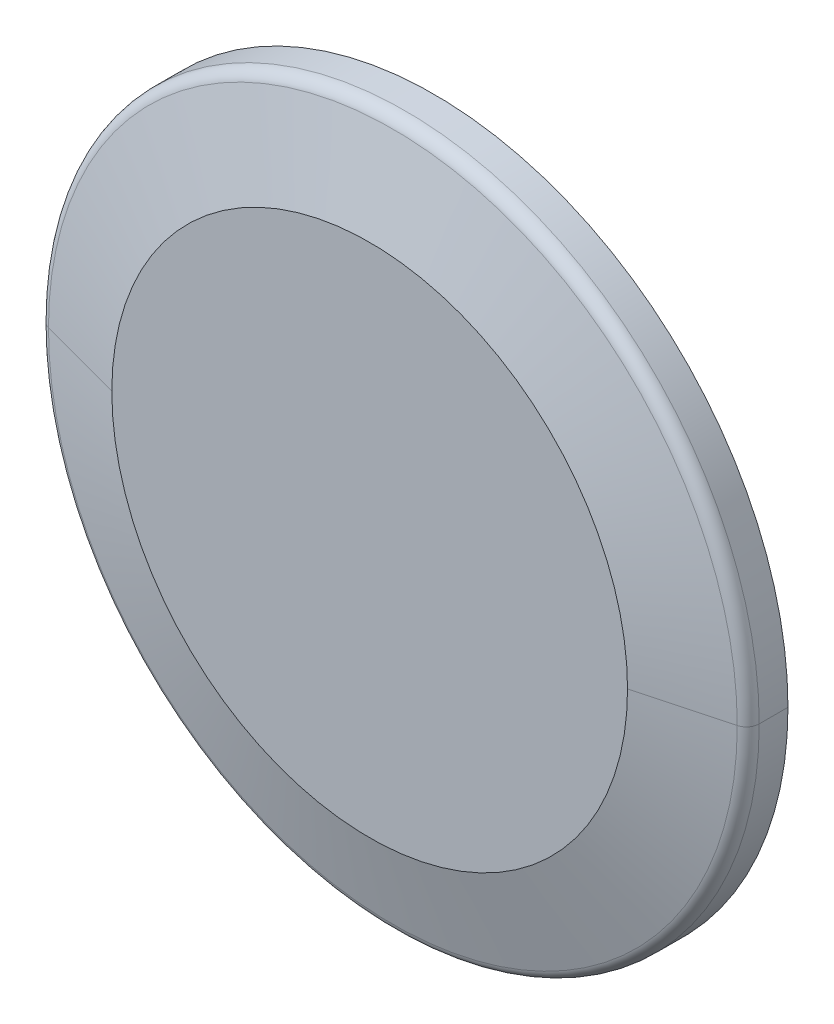
ISO-10303-21;
HEADER;
FILE_DESCRIPTION(('STEP AP214'),'2;1');
FILE_NAME('part.step','',(''),(''),'','','');
FILE_SCHEMA(('AUTOMOTIVE_DESIGN { 1 0 10303 214 1 1 1 1 }'));
ENDSEC;
DATA;
#1=APPLICATION_CONTEXT('core data for automotive mechanical design processes');
#2=APPLICATION_PROTOCOL_DEFINITION('international standard','automotive_design',2000,#1);
#3=PRODUCT_CONTEXT('',#1,'mechanical');
#4=PRODUCT('Part','Part','',(#3));
#5=PRODUCT_RELATED_PRODUCT_CATEGORY('part','',(#4));
#6=PRODUCT_DEFINITION_FORMATION('','',#4);
#7=PRODUCT_DEFINITION_CONTEXT('part definition',#1,'design');
#8=PRODUCT_DEFINITION('design','',#6,#7);
#9=PRODUCT_DEFINITION_SHAPE('','',#8);
#10=(LENGTH_UNIT() NAMED_UNIT(*) SI_UNIT(.MILLI.,.METRE.));
#11=(NAMED_UNIT(*) PLANE_ANGLE_UNIT() SI_UNIT($,.RADIAN.));
#12=(NAMED_UNIT(*) SI_UNIT($,.STERADIAN.) SOLID_ANGLE_UNIT());
#13=UNCERTAINTY_MEASURE_WITH_UNIT(LENGTH_MEASURE(1.E-05),#10,'distance_accuracy_value','');
#14=(GEOMETRIC_REPRESENTATION_CONTEXT(3) GLOBAL_UNCERTAINTY_ASSIGNED_CONTEXT((#13)) GLOBAL_UNIT_ASSIGNED_CONTEXT((#10,
#11,#12)) REPRESENTATION_CONTEXT('',''));
#15=CARTESIAN_POINT('',(0.,0.,0.));
#16=DIRECTION('',(0.,0.,1.));
#17=DIRECTION('',(1.,0.,0.));
#18=AXIS2_PLACEMENT_3D('',#15,#16,#17);
#19=CARTESIAN_POINT('',(0.,0.,-2.7675677094773));
#20=DIRECTION('',(0.,0.,-1.));
#21=DIRECTION('',(-1.,0.,0.));
#22=AXIS2_PLACEMENT_3D('',#19,#20,#21);
#23=TOROIDAL_SURFACE('',#22,26.5,1.);
#24=CARTESIAN_POINT('',(0.,0.,-1.80164188318824));
#25=DIRECTION('',(0.,0.,-1.));
#26=DIRECTION('',(-1.,0.,0.));
#27=AXIS2_PLACEMENT_3D('',#24,#25,#26);
#28=CIRCLE('',#27,26.7588190451025);
#29=CARTESIAN_POINT('',(-26.7588190451025,0.,-1.80164188318824));
#30=VERTEX_POINT('',#29);
#31=CARTESIAN_POINT('',(26.7588190451025,0.,-1.80164188318824));
#32=VERTEX_POINT('',#31);
#33=EDGE_CURVE('E10',#30,#32,#28,.T.);
#34=ORIENTED_EDGE('',*,*,#33,.T.);
#35=CARTESIAN_POINT('',(26.5,0.,-2.7675677094773));
#36=DIRECTION('',(0.,1.,0.));
#37=DIRECTION('',(-1.,0.,0.));
#38=AXIS2_PLACEMENT_3D('',#35,#36,#37);
#39=CIRCLE('',#38,1.);
#40=CARTESIAN_POINT('',(27.5,0.,-2.7675677094773));
#41=VERTEX_POINT('',#40);
#42=EDGE_CURVE('E26',#32,#41,#39,.T.);
#43=ORIENTED_EDGE('',*,*,#42,.T.);
#44=CARTESIAN_POINT('',(0.,0.,-2.7675677094773));
#45=DIRECTION('',(0.,0.,-1.));
#46=DIRECTION('',(-1.,0.,0.));
#47=AXIS2_PLACEMENT_3D('',#44,#45,#46);
#48=CIRCLE('',#47,27.5);
#49=CARTESIAN_POINT('',(-27.5,0.,-2.7675677094773));
#50=VERTEX_POINT('',#49);
#51=EDGE_CURVE('E126',#50,#41,#48,.T.);
#52=ORIENTED_EDGE('',*,*,#51,.F.);
#53=CARTESIAN_POINT('',(-26.5,0.,-2.7675677094773));
#54=DIRECTION('',(0.,-1.,0.));
#55=DIRECTION('',(0.,0.,-1.));
#56=AXIS2_PLACEMENT_3D('',#53,#54,#55);
#57=CIRCLE('',#56,1.);
#58=EDGE_CURVE('E187',#30,#50,#57,.T.);
#59=ORIENTED_EDGE('',*,*,#58,.F.);
#60=EDGE_LOOP('',(#34,#43,#52,#59));
#61=FACE_BOUND('',#60,.T.);
#62=ADVANCED_FACE('F15',(#61),#23,.T.);
#63=CARTESIAN_POINT('',(0.,0.,0.));
#64=DIRECTION('',(0.,0.,-1.));
#65=DIRECTION('',(-1.,0.,0.));
#66=AXIS2_PLACEMENT_3D('',#63,#64,#65);
#67=CONICAL_SURFACE('',#66,20.035,1.30899693899575);
#68=CARTESIAN_POINT('',(0.,0.,0.));
#69=DIRECTION('',(0.,0.,-1.));
#70=DIRECTION('',(-1.,0.,0.));
#71=AXIS2_PLACEMENT_3D('',#68,#69,#70);
#72=CIRCLE('',#71,20.035);
#73=CARTESIAN_POINT('',(-20.035,0.,0.));
#74=VERTEX_POINT('',#73);
#75=CARTESIAN_POINT('',(20.035,0.,0.));
#76=VERTEX_POINT('',#75);
#77=EDGE_CURVE('E161',#74,#76,#72,.T.);
#78=ORIENTED_EDGE('',*,*,#77,.T.);
#79=DIRECTION('',(0.965925826289068,0.,-0.258819045102523));
#80=VECTOR('',#79,1.);
#81=CARTESIAN_POINT('',(20.035,0.,0.));
#82=LINE('',#81,#80);
#83=EDGE_CURVE('E40',#76,#32,#82,.T.);
#84=ORIENTED_EDGE('',*,*,#83,.T.);
#85=ORIENTED_EDGE('',*,*,#33,.F.);
#86=DIRECTION('',(-0.965925826289068,0.,-0.258819045102523));
#87=VECTOR('',#86,1.);
#88=CARTESIAN_POINT('',(-20.035,0.,0.));
#89=LINE('',#88,#87);
#90=EDGE_CURVE('E202',#74,#30,#89,.T.);
#91=ORIENTED_EDGE('',*,*,#90,.F.);
#92=EDGE_LOOP('',(#78,#84,#85,#91));
#93=FACE_BOUND('',#92,.T.);
#94=ADVANCED_FACE('F286',(#93),#67,.T.);
#95=CARTESIAN_POINT('',(0.,0.,-7.87203376127459));
#96=DIRECTION('',(0.,0.,-1.));
#97=DIRECTION('',(-1.,0.,0.));
#98=AXIS2_PLACEMENT_3D('',#95,#96,#97);
#99=CYLINDRICAL_SURFACE('',#98,15.6);
#100=CARTESIAN_POINT('',(0.,0.,-2.8));
#101=DIRECTION('',(0.,0.,-1.));
#102=DIRECTION('',(-1.,0.,0.));
#103=AXIS2_PLACEMENT_3D('',#100,#101,#102);
#104=CIRCLE('',#103,15.6);
#105=CARTESIAN_POINT('',(-15.6,0.,-2.8));
#106=VERTEX_POINT('',#105);
#107=CARTESIAN_POINT('',(15.6,0.,-2.8));
#108=VERTEX_POINT('',#107);
#109=EDGE_CURVE('E162',#106,#108,#104,.T.);
#110=ORIENTED_EDGE('',*,*,#109,.T.);
#111=DIRECTION('',(0.,0.,-1.));
#112=VECTOR('',#111,1.);
#113=CARTESIAN_POINT('',(15.6,0.,-7.87203376127459));
#114=LINE('',#113,#112);
#115=CARTESIAN_POINT('',(15.6,0.,-5.));
#116=VERTEX_POINT('',#115);
#117=EDGE_CURVE('E229',#108,#116,#114,.T.);
#118=ORIENTED_EDGE('',*,*,#117,.T.);
#119=CARTESIAN_POINT('',(0.,0.,-5.));
#120=DIRECTION('',(0.,0.,-1.));
#121=DIRECTION('',(-1.,0.,0.));
#122=AXIS2_PLACEMENT_3D('',#119,#120,#121);
#123=CIRCLE('',#122,15.6);
#124=CARTESIAN_POINT('',(-15.6,0.,-5.));
#125=VERTEX_POINT('',#124);
#126=EDGE_CURVE('E155',#125,#116,#123,.T.);
#127=ORIENTED_EDGE('',*,*,#126,.F.);
#128=DIRECTION('',(0.,0.,-1.));
#129=VECTOR('',#128,1.);
#130=CARTESIAN_POINT('',(-15.6,0.,-7.87203376127459));
#131=LINE('',#130,#129);
#132=EDGE_CURVE('E158',#106,#125,#131,.T.);
#133=ORIENTED_EDGE('',*,*,#132,.F.);
#134=EDGE_LOOP('',(#110,#118,#127,#133));
#135=FACE_BOUND('',#134,.T.);
#136=ADVANCED_FACE('F307',(#135),#99,.T.);
#137=CARTESIAN_POINT('',(0.,0.,-2.8));
#138=DIRECTION('',(0.,0.,-1.));
#139=DIRECTION('',(-1.,0.,0.));
#140=AXIS2_PLACEMENT_3D('',#137,#138,#139);
#141=TOROIDAL_SURFACE('',#140,15.9,0.3);
#142=CARTESIAN_POINT('',(0.,0.,-2.8));
#143=DIRECTION('',(0.,0.,-1.));
#144=DIRECTION('',(-1.,0.,0.));
#145=AXIS2_PLACEMENT_3D('',#142,#143,#144);
#146=CIRCLE('',#145,15.6);
#147=EDGE_CURVE('E258',#108,#106,#146,.T.);
#148=ORIENTED_EDGE('',*,*,#147,.F.);
#149=CARTESIAN_POINT('',(15.9,0.,-2.8));
#150=DIRECTION('',(0.,1.,0.));
#151=DIRECTION('',(-1.,0.,0.));
#152=AXIS2_PLACEMENT_3D('',#149,#150,#151);
#153=CIRCLE('',#152,0.3);
#154=CARTESIAN_POINT('',(15.9,0.,-2.5));
#155=VERTEX_POINT('',#154);
#156=EDGE_CURVE('E260',#108,#155,#153,.T.);
#157=ORIENTED_EDGE('',*,*,#156,.T.);
#158=CARTESIAN_POINT('',(0.,0.,-2.5));
#159=DIRECTION('',(0.,0.,-1.));
#160=DIRECTION('',(-1.,0.,0.));
#161=AXIS2_PLACEMENT_3D('',#158,#159,#160);
#162=CIRCLE('',#161,15.9);
#163=CARTESIAN_POINT('',(-15.9,0.,-2.5));
#164=VERTEX_POINT('',#163);
#165=EDGE_CURVE('E19',#155,#164,#162,.T.);
#166=ORIENTED_EDGE('',*,*,#165,.T.);
#167=CARTESIAN_POINT('',(-15.9,0.,-2.8));
#168=DIRECTION('',(0.,-1.,0.));
#169=DIRECTION('',(0.,0.,-1.));
#170=AXIS2_PLACEMENT_3D('',#167,#168,#169);
#171=CIRCLE('',#170,0.3);
#172=EDGE_CURVE('E175',#106,#164,#171,.T.);
#173=ORIENTED_EDGE('',*,*,#172,.F.);
#174=EDGE_LOOP('',(#148,#157,#166,#173));
#175=FACE_BOUND('',#174,.T.);
#176=ADVANCED_FACE('F328',(#175),#141,.F.);
#177=CARTESIAN_POINT('',(0.,0.,-2.8));
#178=DIRECTION('',(0.,0.,-1.));
#179=DIRECTION('',(-1.,0.,0.));
#180=AXIS2_PLACEMENT_3D('',#177,#178,#179);
#181=TOROIDAL_SURFACE('',#180,20.3,0.3);
#182=CARTESIAN_POINT('',(0.,0.,-2.5));
#183=DIRECTION('',(0.,0.,-1.));
#184=DIRECTION('',(-1.,0.,0.));
#185=AXIS2_PLACEMENT_3D('',#182,#183,#184);
#186=CIRCLE('',#185,20.3);
#187=CARTESIAN_POINT('',(20.3,0.,-2.5));
#188=VERTEX_POINT('',#187);
#189=CARTESIAN_POINT('',(-20.3,0.,-2.5));
#190=VERTEX_POINT('',#189);
#191=EDGE_CURVE('E166',#188,#190,#186,.T.);
#192=ORIENTED_EDGE('',*,*,#191,.F.);
#193=CARTESIAN_POINT('',(20.3,0.,-2.8));
#194=DIRECTION('',(0.,1.,0.));
#195=DIRECTION('',(-1.,0.,0.));
#196=AXIS2_PLACEMENT_3D('',#193,#194,#195);
#197=CIRCLE('',#196,0.3);
#198=CARTESIAN_POINT('',(20.6,0.,-2.8));
#199=VERTEX_POINT('',#198);
#200=EDGE_CURVE('E220',#188,#199,#197,.T.);
#201=ORIENTED_EDGE('',*,*,#200,.T.);
#202=CARTESIAN_POINT('',(0.,0.,-2.8));
#203=DIRECTION('',(0.,0.,-1.));
#204=DIRECTION('',(-1.,0.,0.));
#205=AXIS2_PLACEMENT_3D('',#202,#203,#204);
#206=CIRCLE('',#205,20.6);
#207=CARTESIAN_POINT('',(-20.6,0.,-2.8));
#208=VERTEX_POINT('',#207);
#209=EDGE_CURVE('E131',#199,#208,#206,.T.);
#210=ORIENTED_EDGE('',*,*,#209,.T.);
#211=CARTESIAN_POINT('',(-20.3,0.,-2.8));
#212=DIRECTION('',(0.,-1.,0.));
#213=DIRECTION('',(0.,0.,-1.));
#214=AXIS2_PLACEMENT_3D('',#211,#212,#213);
#215=CIRCLE('',#214,0.3);
#216=EDGE_CURVE('E140',#190,#208,#215,.T.);
#217=ORIENTED_EDGE('',*,*,#216,.F.);
#218=EDGE_LOOP('',(#192,#201,#210,#217));
#219=FACE_BOUND('',#218,.T.);
#220=ADVANCED_FACE('F339',(#219),#181,.F.);
#221=CARTESIAN_POINT('',(0.,0.,-7.87203376127459));
#222=DIRECTION('',(0.,0.,-1.));
#223=DIRECTION('',(-1.,0.,0.));
#224=AXIS2_PLACEMENT_3D('',#221,#222,#223);
#225=CYLINDRICAL_SURFACE('',#224,20.6);
#226=ORIENTED_EDGE('',*,*,#209,.F.);
#227=DIRECTION('',(0.,0.,-1.));
#228=VECTOR('',#227,1.);
#229=CARTESIAN_POINT('',(20.6,0.,-7.87203376127459));
#230=LINE('',#229,#228);
#231=CARTESIAN_POINT('',(20.6,0.,-5.));
#232=VERTEX_POINT('',#231);
#233=EDGE_CURVE('E125',#199,#232,#230,.T.);
#234=ORIENTED_EDGE('',*,*,#233,.T.);
#235=CARTESIAN_POINT('',(0.,0.,-5.));
#236=DIRECTION('',(0.,0.,-1.));
#237=DIRECTION('',(-1.,0.,0.));
#238=AXIS2_PLACEMENT_3D('',#235,#236,#237);
#239=CIRCLE('',#238,20.6);
#240=CARTESIAN_POINT('',(-20.6,0.,-5.));
#241=VERTEX_POINT('',#240);
#242=EDGE_CURVE('E117',#232,#241,#239,.T.);
#243=ORIENTED_EDGE('',*,*,#242,.T.);
#244=DIRECTION('',(0.,0.,-1.));
#245=VECTOR('',#244,1.);
#246=CARTESIAN_POINT('',(-20.6,0.,-7.87203376127459));
#247=LINE('',#246,#245);
#248=EDGE_CURVE('E138',#208,#241,#247,.T.);
#249=ORIENTED_EDGE('',*,*,#248,.F.);
#250=EDGE_LOOP('',(#226,#234,#243,#249));
#251=FACE_BOUND('',#250,.T.);
#252=ADVANCED_FACE('F129',(#251),#225,.F.);
#253=CARTESIAN_POINT('',(0.,0.,-7.87203376127459));
#254=DIRECTION('',(0.,0.,-1.));
#255=DIRECTION('',(-1.,0.,0.));
#256=AXIS2_PLACEMENT_3D('',#253,#254,#255);
#257=CYLINDRICAL_SURFACE('',#256,27.5);
#258=ORIENTED_EDGE('',*,*,#51,.T.);
#259=DIRECTION('',(0.,0.,-1.));
#260=VECTOR('',#259,1.);
#261=CARTESIAN_POINT('',(27.5,0.,-7.87203376127459));
#262=LINE('',#261,#260);
#263=CARTESIAN_POINT('',(27.5,0.,-5.));
#264=VERTEX_POINT('',#263);
#265=EDGE_CURVE('E242',#41,#264,#262,.T.);
#266=ORIENTED_EDGE('',*,*,#265,.T.);
#267=CARTESIAN_POINT('',(0.,0.,-5.));
#268=DIRECTION('',(0.,0.,-1.));
#269=DIRECTION('',(-1.,0.,0.));
#270=AXIS2_PLACEMENT_3D('',#267,#268,#269);
#271=CIRCLE('',#270,27.5);
#272=CARTESIAN_POINT('',(-27.5,0.,-5.));
#273=VERTEX_POINT('',#272);
#274=EDGE_CURVE('E191',#273,#264,#271,.T.);
#275=ORIENTED_EDGE('',*,*,#274,.F.);
#276=DIRECTION('',(0.,0.,-1.));
#277=VECTOR('',#276,1.);
#278=CARTESIAN_POINT('',(-27.5,0.,-7.87203376127459));
#279=LINE('',#278,#277);
#280=EDGE_CURVE('E193',#50,#273,#279,.T.);
#281=ORIENTED_EDGE('',*,*,#280,.F.);
#282=EDGE_LOOP('',(#258,#266,#275,#281));
#283=FACE_BOUND('',#282,.T.);
#284=ADVANCED_FACE('F280',(#283),#257,.T.);
#285=CARTESIAN_POINT('',(0.,0.,-7.87203376127459));
#286=DIRECTION('',(0.,0.,-1.));
#287=DIRECTION('',(-1.,0.,0.));
#288=AXIS2_PLACEMENT_3D('',#285,#286,#287);
#289=CYLINDRICAL_SURFACE('',#288,27.5);
#290=ORIENTED_EDGE('',*,*,#265,.F.);
#291=CARTESIAN_POINT('',(0.,0.,-2.7675677094773));
#292=DIRECTION('',(0.,0.,-1.));
#293=DIRECTION('',(-1.,0.,0.));
#294=AXIS2_PLACEMENT_3D('',#291,#292,#293);
#295=CIRCLE('',#294,27.5);
#296=EDGE_CURVE('E153',#41,#50,#295,.T.);
#297=ORIENTED_EDGE('',*,*,#296,.T.);
#298=ORIENTED_EDGE('',*,*,#280,.T.);
#299=CARTESIAN_POINT('',(0.,0.,-5.));
#300=DIRECTION('',(0.,0.,-1.));
#301=DIRECTION('',(-1.,0.,0.));
#302=AXIS2_PLACEMENT_3D('',#299,#300,#301);
#303=CIRCLE('',#302,27.5);
#304=EDGE_CURVE('E147',#264,#273,#303,.T.);
#305=ORIENTED_EDGE('',*,*,#304,.F.);
#306=EDGE_LOOP('',(#290,#297,#298,#305));
#307=FACE_BOUND('',#306,.T.);
#308=ADVANCED_FACE('F240',(#307),#289,.T.);
#309=CARTESIAN_POINT('',(20.6,0.,-5.));
#310=DIRECTION('',(0.,0.,1.));
#311=DIRECTION('',(1.,0.,0.));
#312=AXIS2_PLACEMENT_3D('',#309,#310,#311);
#313=PLANE('',#312);
#314=ORIENTED_EDGE('',*,*,#274,.T.);
#315=ORIENTED_EDGE('',*,*,#304,.T.);
#316=EDGE_LOOP('',(#314,#315));
#317=FACE_BOUND('',#316,.T.);
#318=CARTESIAN_POINT('',(0.,0.,-5.));
#319=DIRECTION('',(0.,0.,-1.));
#320=DIRECTION('',(-1.,0.,0.));
#321=AXIS2_PLACEMENT_3D('',#318,#319,#320);
#322=CIRCLE('',#321,20.6);
#323=EDGE_CURVE('E121',#241,#232,#322,.T.);
#324=ORIENTED_EDGE('',*,*,#323,.F.);
#325=ORIENTED_EDGE('',*,*,#242,.F.);
#326=EDGE_LOOP('',(#324,#325));
#327=FACE_BOUND('',#326,.T.);
#328=ADVANCED_FACE('F119',(#317,#327),#313,.F.);
#329=CARTESIAN_POINT('',(0.,0.,-7.87203376127459));
#330=DIRECTION('',(0.,0.,-1.));
#331=DIRECTION('',(-1.,0.,0.));
#332=AXIS2_PLACEMENT_3D('',#329,#330,#331);
#333=CYLINDRICAL_SURFACE('',#332,20.6);
#334=ORIENTED_EDGE('',*,*,#233,.F.);
#335=CARTESIAN_POINT('',(0.,0.,-2.8));
#336=DIRECTION('',(0.,0.,-1.));
#337=DIRECTION('',(-1.,0.,0.));
#338=AXIS2_PLACEMENT_3D('',#335,#336,#337);
#339=CIRCLE('',#338,20.6);
#340=EDGE_CURVE('E149',#208,#199,#339,.T.);
#341=ORIENTED_EDGE('',*,*,#340,.F.);
#342=ORIENTED_EDGE('',*,*,#248,.T.);
#343=ORIENTED_EDGE('',*,*,#323,.T.);
#344=EDGE_LOOP('',(#334,#341,#342,#343));
#345=FACE_BOUND('',#344,.T.);
#346=ADVANCED_FACE('F137',(#345),#333,.F.);
#347=CARTESIAN_POINT('',(0.,0.,-2.8));
#348=DIRECTION('',(0.,0.,-1.));
#349=DIRECTION('',(-1.,0.,0.));
#350=AXIS2_PLACEMENT_3D('',#347,#348,#349);
#351=TOROIDAL_SURFACE('',#350,20.3,0.3);
#352=ORIENTED_EDGE('',*,*,#200,.F.);
#353=CARTESIAN_POINT('',(0.,0.,-2.5));
#354=DIRECTION('',(0.,0.,-1.));
#355=DIRECTION('',(-1.,0.,0.));
#356=AXIS2_PLACEMENT_3D('',#353,#354,#355);
#357=CIRCLE('',#356,20.3);
#358=EDGE_CURVE('E163',#190,#188,#357,.T.);
#359=ORIENTED_EDGE('',*,*,#358,.F.);
#360=ORIENTED_EDGE('',*,*,#216,.T.);
#361=ORIENTED_EDGE('',*,*,#340,.T.);
#362=EDGE_LOOP('',(#352,#359,#360,#361));
#363=FACE_BOUND('',#362,.T.);
#364=ADVANCED_FACE('F17',(#363),#351,.F.);
#365=CARTESIAN_POINT('',(20.3,0.,-2.5));
#366=DIRECTION('',(0.,0.,1.));
#367=DIRECTION('',(1.,0.,0.));
#368=AXIS2_PLACEMENT_3D('',#365,#366,#367);
#369=PLANE('',#368);
#370=ORIENTED_EDGE('',*,*,#358,.T.);
#371=ORIENTED_EDGE('',*,*,#191,.T.);
#372=EDGE_LOOP('',(#370,#371));
#373=FACE_BOUND('',#372,.T.);
#374=CARTESIAN_POINT('',(0.,0.,-2.5));
#375=DIRECTION('',(0.,0.,-1.));
#376=DIRECTION('',(-1.,0.,0.));
#377=AXIS2_PLACEMENT_3D('',#374,#375,#376);
#378=CIRCLE('',#377,15.9);
#379=EDGE_CURVE('E181',#164,#155,#378,.T.);
#380=ORIENTED_EDGE('',*,*,#379,.F.);
#381=ORIENTED_EDGE('',*,*,#165,.F.);
#382=EDGE_LOOP('',(#380,#381));
#383=FACE_BOUND('',#382,.T.);
#384=ADVANCED_FACE('F318',(#373,#383),#369,.F.);
#385=CARTESIAN_POINT('',(0.,0.,-2.8));
#386=DIRECTION('',(0.,0.,-1.));
#387=DIRECTION('',(-1.,0.,0.));
#388=AXIS2_PLACEMENT_3D('',#385,#386,#387);
#389=TOROIDAL_SURFACE('',#388,15.9,0.3);
#390=ORIENTED_EDGE('',*,*,#156,.F.);
#391=ORIENTED_EDGE('',*,*,#109,.F.);
#392=ORIENTED_EDGE('',*,*,#172,.T.);
#393=ORIENTED_EDGE('',*,*,#379,.T.);
#394=EDGE_LOOP('',(#390,#391,#392,#393));
#395=FACE_BOUND('',#394,.T.);
#396=ADVANCED_FACE('F311',(#395),#389,.F.);
#397=CARTESIAN_POINT('',(0.,0.,-7.87203376127459));
#398=DIRECTION('',(0.,0.,-1.));
#399=DIRECTION('',(-1.,0.,0.));
#400=AXIS2_PLACEMENT_3D('',#397,#398,#399);
#401=CYLINDRICAL_SURFACE('',#400,15.6);
#402=ORIENTED_EDGE('',*,*,#117,.F.);
#403=ORIENTED_EDGE('',*,*,#147,.T.);
#404=ORIENTED_EDGE('',*,*,#132,.T.);
#405=CARTESIAN_POINT('',(0.,0.,-5.));
#406=DIRECTION('',(0.,0.,-1.));
#407=DIRECTION('',(-1.,0.,0.));
#408=AXIS2_PLACEMENT_3D('',#405,#406,#407);
#409=CIRCLE('',#408,15.6);
#410=EDGE_CURVE('E159',#116,#125,#409,.T.);
#411=ORIENTED_EDGE('',*,*,#410,.F.);
#412=EDGE_LOOP('',(#402,#403,#404,#411));
#413=FACE_BOUND('',#412,.T.);
#414=ADVANCED_FACE('F299',(#413),#401,.T.);
#415=CARTESIAN_POINT('',(15.6,0.,-5.));
#416=DIRECTION('',(0.,0.,1.));
#417=DIRECTION('',(1.,0.,0.));
#418=AXIS2_PLACEMENT_3D('',#415,#416,#417);
#419=PLANE('',#418);
#420=ORIENTED_EDGE('',*,*,#126,.T.);
#421=ORIENTED_EDGE('',*,*,#410,.T.);
#422=EDGE_LOOP('',(#420,#421));
#423=FACE_BOUND('',#422,.T.);
#424=ADVANCED_FACE('F291',(#423),#419,.F.);
#425=CARTESIAN_POINT('',(20.035,0.,0.));
#426=DIRECTION('',(0.,0.,-1.));
#427=DIRECTION('',(0.,-1.,0.));
#428=AXIS2_PLACEMENT_3D('',#425,#426,#427);
#429=PLANE('',#428);
#430=ORIENTED_EDGE('',*,*,#77,.F.);
#431=CARTESIAN_POINT('',(0.,0.,0.));
#432=DIRECTION('',(0.,0.,-1.));
#433=DIRECTION('',(-1.,0.,0.));
#434=AXIS2_PLACEMENT_3D('',#431,#432,#433);
#435=CIRCLE('',#434,20.035);
#436=EDGE_CURVE('E185',#76,#74,#435,.T.);
#437=ORIENTED_EDGE('',*,*,#436,.F.);
#438=EDGE_LOOP('',(#430,#437));
#439=FACE_BOUND('',#438,.T.);
#440=ADVANCED_FACE('F289',(#439),#429,.F.);
#441=CARTESIAN_POINT('',(0.,0.,0.));
#442=DIRECTION('',(0.,0.,-1.));
#443=DIRECTION('',(-1.,0.,0.));
#444=AXIS2_PLACEMENT_3D('',#441,#442,#443);
#445=CONICAL_SURFACE('',#444,20.035,1.30899693899575);
#446=ORIENTED_EDGE('',*,*,#83,.F.);
#447=ORIENTED_EDGE('',*,*,#436,.T.);
#448=ORIENTED_EDGE('',*,*,#90,.T.);
#449=CARTESIAN_POINT('',(0.,0.,-1.80164188318824));
#450=DIRECTION('',(0.,0.,-1.));
#451=DIRECTION('',(-1.,0.,0.));
#452=AXIS2_PLACEMENT_3D('',#449,#450,#451);
#453=CIRCLE('',#452,26.7588190451025);
#454=EDGE_CURVE('E189',#32,#30,#453,.T.);
#455=ORIENTED_EDGE('',*,*,#454,.F.);
#456=EDGE_LOOP('',(#446,#447,#448,#455));
#457=FACE_BOUND('',#456,.T.);
#458=ADVANCED_FACE('F284',(#457),#445,.T.);
#459=CARTESIAN_POINT('',(0.,0.,-2.7675677094773));
#460=DIRECTION('',(0.,0.,-1.));
#461=DIRECTION('',(-1.,0.,0.));
#462=AXIS2_PLACEMENT_3D('',#459,#460,#461);
#463=TOROIDAL_SURFACE('',#462,26.5,1.);
#464=ORIENTED_EDGE('',*,*,#42,.F.);
#465=ORIENTED_EDGE('',*,*,#454,.T.);
#466=ORIENTED_EDGE('',*,*,#58,.T.);
#467=ORIENTED_EDGE('',*,*,#296,.F.);
#468=EDGE_LOOP('',(#464,#465,#466,#467));
#469=FACE_BOUND('',#468,.T.);
#470=ADVANCED_FACE('F283',(#469),#463,.T.);
#471=CLOSED_SHELL('',(#62,#94,#136,#176,#220,#252,#284,#308,#328,#346,#364,#384,#396,#414,#424,
#440,#458,#470));
#472=MANIFOLD_SOLID_BREP('B1',#471);
#473=ADVANCED_BREP_SHAPE_REPRESENTATION('',(#18,#472),#14);
#474=SHAPE_DEFINITION_REPRESENTATION(#9,#473);
ENDSEC;
END-ISO-10303-21;
